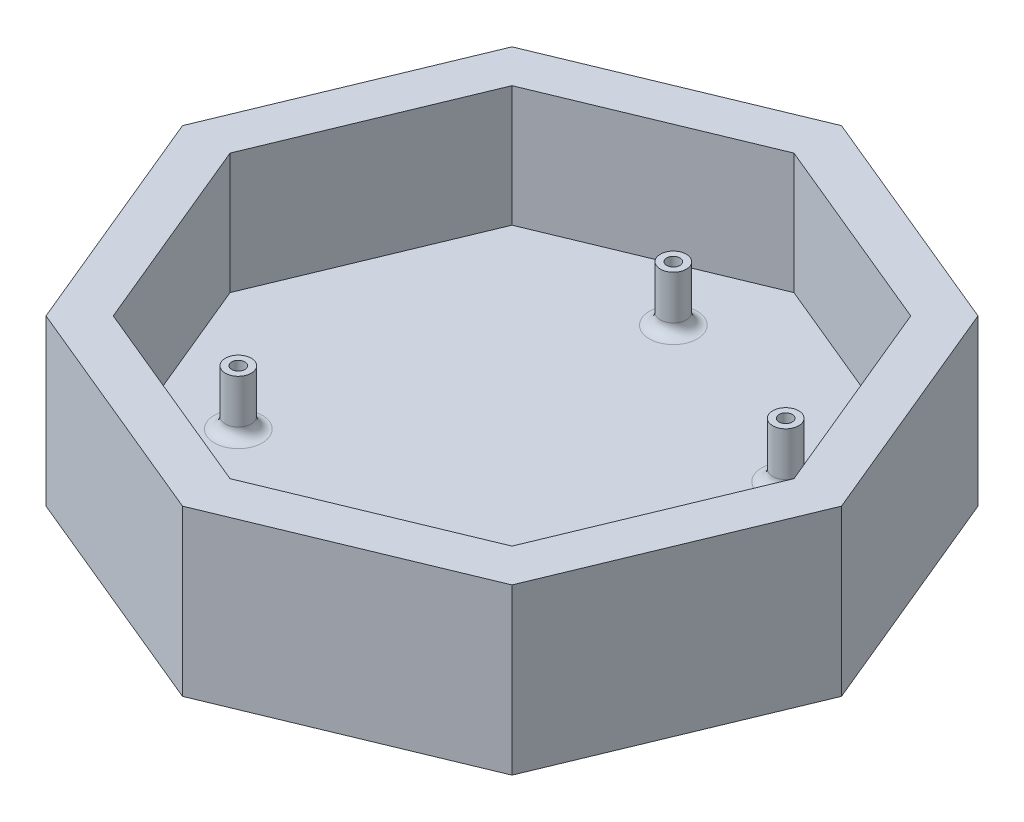
ISO-10303-21;
HEADER;
FILE_DESCRIPTION(('STEP AP214'),'2;1');
FILE_NAME('part.step','',(''),(''),'','','');
FILE_SCHEMA(('AUTOMOTIVE_DESIGN { 1 0 10303 214 1 1 1 1 }'));
ENDSEC;
DATA;
#1=APPLICATION_CONTEXT('core data for automotive mechanical design processes');
#2=APPLICATION_PROTOCOL_DEFINITION('international standard','automotive_design',2000,#1);
#3=PRODUCT_CONTEXT('',#1,'mechanical');
#4=PRODUCT('Part','Part','',(#3));
#5=PRODUCT_RELATED_PRODUCT_CATEGORY('part','',(#4));
#6=PRODUCT_DEFINITION_FORMATION('','',#4);
#7=PRODUCT_DEFINITION_CONTEXT('part definition',#1,'design');
#8=PRODUCT_DEFINITION('design','',#6,#7);
#9=PRODUCT_DEFINITION_SHAPE('','',#8);
#10=(LENGTH_UNIT() NAMED_UNIT(*) SI_UNIT(.MILLI.,.METRE.));
#11=(NAMED_UNIT(*) PLANE_ANGLE_UNIT() SI_UNIT($,.RADIAN.));
#12=(NAMED_UNIT(*) SI_UNIT($,.STERADIAN.) SOLID_ANGLE_UNIT());
#13=UNCERTAINTY_MEASURE_WITH_UNIT(LENGTH_MEASURE(1.E-05),#10,'distance_accuracy_value','');
#14=(GEOMETRIC_REPRESENTATION_CONTEXT(3) GLOBAL_UNCERTAINTY_ASSIGNED_CONTEXT((#13)) GLOBAL_UNIT_ASSIGNED_CONTEXT((#10,
#11,#12)) REPRESENTATION_CONTEXT('',''));
#15=CARTESIAN_POINT('',(0.,0.,0.));
#16=DIRECTION('',(0.,0.,1.));
#17=DIRECTION('',(1.,0.,0.));
#18=AXIS2_PLACEMENT_3D('',#15,#16,#17);
#19=CARTESIAN_POINT('',(-8.66519910435943E-13,38.1,-76.2));
#20=DIRECTION('',(0.3826834323651,0.,0.923879532511282));
#21=DIRECTION('',(0.923879532511282,0.,-0.3826834323651));
#22=AXIS2_PLACEMENT_3D('',#19,#20,#21);
#23=PLANE('',#22);
#24=DIRECTION('',(-0.923879532511282,0.,0.3826834323651));
#25=VECTOR('',#24,1.);
#26=CARTESIAN_POINT('',(-8.66519910435943E-13,0.,-76.2));
#27=LINE('',#26,#25);
#28=CARTESIAN_POINT('',(-8.66519910435943E-13,0.,-76.2));
#29=VERTEX_POINT('',#28);
#30=CARTESIAN_POINT('',(-53.8815367264155,0.,-53.8815367264143));
#31=VERTEX_POINT('',#30);
#32=EDGE_CURVE('E146',#29,#31,#27,.T.);
#33=ORIENTED_EDGE('',*,*,#32,.T.);
#34=DIRECTION('',(0.,-1.,0.));
#35=VECTOR('',#34,1.);
#36=CARTESIAN_POINT('',(-53.8815367264155,38.1,-53.8815367264143));
#37=LINE('',#36,#35);
#38=CARTESIAN_POINT('',(-53.8815367264155,38.1,-53.8815367264143));
#39=VERTEX_POINT('',#38);
#40=EDGE_CURVE('E175',#39,#31,#37,.T.);
#41=ORIENTED_EDGE('',*,*,#40,.F.);
#42=DIRECTION('',(-0.923879532511282,0.,0.3826834323651));
#43=VECTOR('',#42,1.);
#44=CARTESIAN_POINT('',(-8.66519910435943E-13,38.1,-76.2));
#45=LINE('',#44,#43);
#46=CARTESIAN_POINT('',(-8.66519910435943E-13,38.1,-76.2));
#47=VERTEX_POINT('',#46);
#48=EDGE_CURVE('E162',#47,#39,#45,.T.);
#49=ORIENTED_EDGE('',*,*,#48,.F.);
#50=DIRECTION('',(0.,-1.,0.));
#51=VECTOR('',#50,1.);
#52=CARTESIAN_POINT('',(-8.66519910435943E-13,38.1,-76.2));
#53=LINE('',#52,#51);
#54=EDGE_CURVE('E142',#47,#29,#53,.T.);
#55=ORIENTED_EDGE('',*,*,#54,.T.);
#56=EDGE_LOOP('',(#33,#41,#49,#55));
#57=FACE_BOUND('',#56,.T.);
#58=ADVANCED_FACE('F37',(#57),#23,.F.);
#59=CARTESIAN_POINT('',(-53.8815367264155,38.1,-53.8815367264143));
#60=DIRECTION('',(0.923879532511291,0.,0.382683432365079));
#61=DIRECTION('',(0.382683432365079,0.,-0.923879532511291));
#62=AXIS2_PLACEMENT_3D('',#59,#60,#61);
#63=PLANE('',#62);
#64=DIRECTION('',(-0.382683432365079,0.,0.923879532511291));
#65=VECTOR('',#64,1.);
#66=CARTESIAN_POINT('',(-53.8815367264155,0.,-53.8815367264143));
#67=LINE('',#66,#65);
#68=CARTESIAN_POINT('',(-76.2,0.,8.80545636405828E-13));
#69=VERTEX_POINT('',#68);
#70=EDGE_CURVE('E149',#31,#69,#67,.T.);
#71=ORIENTED_EDGE('',*,*,#70,.T.);
#72=DIRECTION('',(0.,-1.,0.));
#73=VECTOR('',#72,1.);
#74=CARTESIAN_POINT('',(-76.2,38.1,8.80545636405828E-13));
#75=LINE('',#74,#73);
#76=CARTESIAN_POINT('',(-76.2,38.1,8.80545636405828E-13));
#77=VERTEX_POINT('',#76);
#78=EDGE_CURVE('E172',#77,#69,#75,.T.);
#79=ORIENTED_EDGE('',*,*,#78,.F.);
#80=DIRECTION('',(-0.382683432365079,0.,0.923879532511291));
#81=VECTOR('',#80,1.);
#82=CARTESIAN_POINT('',(-53.8815367264155,38.1,-53.8815367264143));
#83=LINE('',#82,#81);
#84=EDGE_CURVE('E103',#39,#77,#83,.T.);
#85=ORIENTED_EDGE('',*,*,#84,.F.);
#86=ORIENTED_EDGE('',*,*,#40,.T.);
#87=EDGE_LOOP('',(#71,#79,#85,#86));
#88=FACE_BOUND('',#87,.T.);
#89=ADVANCED_FACE('F215',(#88),#63,.F.);
#90=CARTESIAN_POINT('',(-76.2,38.1,8.80545636405828E-13));
#91=DIRECTION('',(0.923879532511282,0.,-0.3826834323651));
#92=DIRECTION('',(-0.3826834323651,0.,-0.923879532511283));
#93=AXIS2_PLACEMENT_3D('',#90,#91,#92);
#94=PLANE('',#93);
#95=DIRECTION('',(0.3826834323651,0.,0.923879532511282));
#96=VECTOR('',#95,1.);
#97=CARTESIAN_POINT('',(-76.2,0.,8.80545636405828E-13));
#98=LINE('',#97,#96);
#99=CARTESIAN_POINT('',(-53.8815367264143,0.,53.8815367264155));
#100=VERTEX_POINT('',#99);
#101=EDGE_CURVE('E152',#69,#100,#98,.T.);
#102=ORIENTED_EDGE('',*,*,#101,.T.);
#103=DIRECTION('',(0.,-1.,0.));
#104=VECTOR('',#103,1.);
#105=CARTESIAN_POINT('',(-53.8815367264143,38.1,53.8815367264155));
#106=LINE('',#105,#104);
#107=CARTESIAN_POINT('',(-53.8815367264143,38.1,53.8815367264155));
#108=VERTEX_POINT('',#107);
#109=EDGE_CURVE('E169',#108,#100,#106,.T.);
#110=ORIENTED_EDGE('',*,*,#109,.F.);
#111=DIRECTION('',(0.3826834323651,0.,0.923879532511282));
#112=VECTOR('',#111,1.);
#113=CARTESIAN_POINT('',(-76.2,38.1,8.80545636405828E-13));
#114=LINE('',#113,#112);
#115=EDGE_CURVE('E330',#77,#108,#114,.T.);
#116=ORIENTED_EDGE('',*,*,#115,.F.);
#117=ORIENTED_EDGE('',*,*,#78,.T.);
#118=EDGE_LOOP('',(#102,#110,#116,#117));
#119=FACE_BOUND('',#118,.T.);
#120=ADVANCED_FACE('F221',(#119),#94,.F.);
#121=CARTESIAN_POINT('',(-53.8815367264143,38.1,53.8815367264155));
#122=DIRECTION('',(0.382683432365079,0.,-0.923879532511291));
#123=DIRECTION('',(-0.923879532511291,0.,-0.382683432365079));
#124=AXIS2_PLACEMENT_3D('',#121,#122,#123);
#125=PLANE('',#124);
#126=DIRECTION('',(0.923879532511291,0.,0.382683432365079));
#127=VECTOR('',#126,1.);
#128=CARTESIAN_POINT('',(-53.8815367264143,0.,53.8815367264155));
#129=LINE('',#128,#127);
#130=CARTESIAN_POINT('',(8.69093207777113E-13,0.,76.2));
#131=VERTEX_POINT('',#130);
#132=EDGE_CURVE('E154',#100,#131,#129,.T.);
#133=ORIENTED_EDGE('',*,*,#132,.T.);
#134=DIRECTION('',(0.,-1.,0.));
#135=VECTOR('',#134,1.);
#136=CARTESIAN_POINT('',(8.69093207777113E-13,38.1,76.2));
#137=LINE('',#136,#135);
#138=CARTESIAN_POINT('',(8.69093207777113E-13,38.1,76.2));
#139=VERTEX_POINT('',#138);
#140=EDGE_CURVE('E166',#139,#131,#137,.T.);
#141=ORIENTED_EDGE('',*,*,#140,.F.);
#142=DIRECTION('',(0.923879532511291,0.,0.382683432365079));
#143=VECTOR('',#142,1.);
#144=CARTESIAN_POINT('',(-53.8815367264143,38.1,53.8815367264155));
#145=LINE('',#144,#143);
#146=EDGE_CURVE('E332',#108,#139,#145,.T.);
#147=ORIENTED_EDGE('',*,*,#146,.F.);
#148=ORIENTED_EDGE('',*,*,#109,.T.);
#149=EDGE_LOOP('',(#133,#141,#147,#148));
#150=FACE_BOUND('',#149,.T.);
#151=ADVANCED_FACE('F338',(#150),#125,.F.);
#152=CARTESIAN_POINT('',(8.69093207777113E-13,38.1,76.2));
#153=DIRECTION('',(-0.3826834323651,0.,-0.923879532511282));
#154=DIRECTION('',(-0.923879532511282,0.,0.3826834323651));
#155=AXIS2_PLACEMENT_3D('',#152,#153,#154);
#156=PLANE('',#155);
#157=DIRECTION('',(0.923879532511282,0.,-0.3826834323651));
#158=VECTOR('',#157,1.);
#159=CARTESIAN_POINT('',(8.69093207777113E-13,0.,76.2));
#160=LINE('',#159,#158);
#161=CARTESIAN_POINT('',(53.8815367264155,0.,53.8815367264143));
#162=VERTEX_POINT('',#161);
#163=EDGE_CURVE('E156',#131,#162,#160,.T.);
#164=ORIENTED_EDGE('',*,*,#163,.T.);
#165=DIRECTION('',(0.,-1.,0.));
#166=VECTOR('',#165,1.);
#167=CARTESIAN_POINT('',(53.8815367264155,38.1,53.8815367264143));
#168=LINE('',#167,#166);
#169=CARTESIAN_POINT('',(53.8815367264155,38.1,53.8815367264143));
#170=VERTEX_POINT('',#169);
#171=EDGE_CURVE('E137',#170,#162,#168,.T.);
#172=ORIENTED_EDGE('',*,*,#171,.F.);
#173=DIRECTION('',(0.923879532511282,0.,-0.3826834323651));
#174=VECTOR('',#173,1.);
#175=CARTESIAN_POINT('',(8.69093207777113E-13,38.1,76.2));
#176=LINE('',#175,#174);
#177=EDGE_CURVE('E125',#139,#170,#176,.T.);
#178=ORIENTED_EDGE('',*,*,#177,.F.);
#179=ORIENTED_EDGE('',*,*,#140,.T.);
#180=EDGE_LOOP('',(#164,#172,#178,#179));
#181=FACE_BOUND('',#180,.T.);
#182=ADVANCED_FACE('F342',(#181),#156,.F.);
#183=CARTESIAN_POINT('',(53.8815367264155,38.1,53.8815367264143));
#184=DIRECTION('',(-0.923879532511291,0.,-0.38268343236508));
#185=DIRECTION('',(-0.38268343236508,0.,0.923879532511291));
#186=AXIS2_PLACEMENT_3D('',#183,#184,#185);
#187=PLANE('',#186);
#188=DIRECTION('',(0.38268343236508,0.,-0.923879532511291));
#189=VECTOR('',#188,1.);
#190=CARTESIAN_POINT('',(53.8815367264155,0.,53.8815367264143));
#191=LINE('',#190,#189);
#192=CARTESIAN_POINT('',(76.2,0.,-8.59728954694106E-13));
#193=VERTEX_POINT('',#192);
#194=EDGE_CURVE('E134',#162,#193,#191,.T.);
#195=ORIENTED_EDGE('',*,*,#194,.T.);
#196=DIRECTION('',(0.,-1.,0.));
#197=VECTOR('',#196,1.);
#198=CARTESIAN_POINT('',(76.2,38.1,-8.59728954694106E-13));
#199=LINE('',#198,#197);
#200=CARTESIAN_POINT('',(76.2,38.1,-8.59728954694106E-13));
#201=VERTEX_POINT('',#200);
#202=EDGE_CURVE('E131',#201,#193,#199,.T.);
#203=ORIENTED_EDGE('',*,*,#202,.F.);
#204=DIRECTION('',(0.38268343236508,0.,-0.923879532511291));
#205=VECTOR('',#204,1.);
#206=CARTESIAN_POINT('',(53.8815367264155,38.1,53.8815367264143));
#207=LINE('',#206,#205);
#208=EDGE_CURVE('E118',#170,#201,#207,.T.);
#209=ORIENTED_EDGE('',*,*,#208,.F.);
#210=ORIENTED_EDGE('',*,*,#171,.T.);
#211=EDGE_LOOP('',(#195,#203,#209,#210));
#212=FACE_BOUND('',#211,.T.);
#213=ADVANCED_FACE('F132',(#212),#187,.F.);
#214=CARTESIAN_POINT('',(76.2,38.1,-8.59728954694106E-13));
#215=DIRECTION('',(-0.923879532511282,0.,0.3826834323651));
#216=DIRECTION('',(0.3826834323651,0.,0.923879532511282));
#217=AXIS2_PLACEMENT_3D('',#214,#215,#216);
#218=PLANE('',#217);
#219=DIRECTION('',(-0.3826834323651,0.,-0.923879532511282));
#220=VECTOR('',#219,1.);
#221=CARTESIAN_POINT('',(76.2,0.,-8.59728954694106E-13));
#222=LINE('',#221,#220);
#223=CARTESIAN_POINT('',(53.8815367264143,0.,-53.8815367264155));
#224=VERTEX_POINT('',#223);
#225=EDGE_CURVE('E159',#193,#224,#222,.T.);
#226=ORIENTED_EDGE('',*,*,#225,.T.);
#227=DIRECTION('',(0.,-1.,0.));
#228=VECTOR('',#227,1.);
#229=CARTESIAN_POINT('',(53.8815367264143,38.1,-53.8815367264155));
#230=LINE('',#229,#228);
#231=CARTESIAN_POINT('',(53.8815367264143,38.1,-53.8815367264155));
#232=VERTEX_POINT('',#231);
#233=EDGE_CURVE('E138',#232,#224,#230,.T.);
#234=ORIENTED_EDGE('',*,*,#233,.F.);
#235=DIRECTION('',(-0.3826834323651,0.,-0.923879532511282));
#236=VECTOR('',#235,1.);
#237=CARTESIAN_POINT('',(76.2,38.1,-8.59728954694106E-13));
#238=LINE('',#237,#236);
#239=EDGE_CURVE('E122',#201,#232,#238,.T.);
#240=ORIENTED_EDGE('',*,*,#239,.F.);
#241=ORIENTED_EDGE('',*,*,#202,.T.);
#242=EDGE_LOOP('',(#226,#234,#240,#241));
#243=FACE_BOUND('',#242,.T.);
#244=ADVANCED_FACE('F140',(#243),#218,.F.);
#245=CARTESIAN_POINT('',(53.8815367264143,38.1,-53.8815367264155));
#246=DIRECTION('',(-0.382683432365079,0.,0.923879532511291));
#247=DIRECTION('',(0.923879532511291,0.,0.382683432365079));
#248=AXIS2_PLACEMENT_3D('',#245,#246,#247);
#249=PLANE('',#248);
#250=DIRECTION('',(-0.923879532511291,0.,-0.382683432365079));
#251=VECTOR('',#250,1.);
#252=CARTESIAN_POINT('',(53.8815367264143,0.,-53.8815367264155));
#253=LINE('',#252,#251);
#254=EDGE_CURVE('E94',#224,#29,#253,.T.);
#255=ORIENTED_EDGE('',*,*,#254,.T.);
#256=ORIENTED_EDGE('',*,*,#54,.F.);
#257=DIRECTION('',(-0.923879532511291,0.,-0.382683432365079));
#258=VECTOR('',#257,1.);
#259=CARTESIAN_POINT('',(53.8815367264143,38.1,-53.8815367264155));
#260=LINE('',#259,#258);
#261=EDGE_CURVE('E61',#232,#47,#260,.T.);
#262=ORIENTED_EDGE('',*,*,#261,.F.);
#263=ORIENTED_EDGE('',*,*,#233,.T.);
#264=EDGE_LOOP('',(#255,#256,#262,#263));
#265=FACE_BOUND('',#264,.T.);
#266=ADVANCED_FACE('F346',(#265),#249,.F.);
#267=CARTESIAN_POINT('',(0.,38.1,0.));
#268=DIRECTION('',(0.,1.,0.));
#269=DIRECTION('',(0.,0.,1.));
#270=AXIS2_PLACEMENT_3D('',#267,#268,#269);
#271=PLANE('',#270);
#272=DIRECTION('',(-0.923879532511282,0.,0.3826834323651));
#273=VECTOR('',#272,1.);
#274=CARTESIAN_POINT('',(3.88806367282855,38.1,-66.8133839496854));
#275=LINE('',#274,#273);
#276=CARTESIAN_POINT('',(-7.46309706567966E-13,38.1,-65.2028952450293));
#277=VERTEX_POINT('',#276);
#278=CARTESIAN_POINT('',(-46.1054093807568,38.1,-46.1054093807558));
#279=VERTEX_POINT('',#278);
#280=EDGE_CURVE('E307',#277,#279,#275,.T.);
#281=ORIENTED_EDGE('',*,*,#280,.F.);
#282=DIRECTION('',(-0.923879532511291,0.,-0.382683432365079));
#283=VECTOR('',#282,1.);
#284=CARTESIAN_POINT('',(49.9934730535851,38.1,-44.4949206761008));
#285=LINE('',#284,#283);
#286=CARTESIAN_POINT('',(46.1054093807558,38.1,-46.1054093807568));
#287=VERTEX_POINT('',#286);
#288=EDGE_CURVE('E271',#287,#277,#285,.T.);
#289=ORIENTED_EDGE('',*,*,#288,.F.);
#290=DIRECTION('',(-0.3826834323651,0.,-0.923879532511282));
#291=VECTOR('',#290,1.);
#292=CARTESIAN_POINT('',(66.8133839496854,38.1,3.88806367282856));
#293=LINE('',#292,#291);
#294=CARTESIAN_POINT('',(65.2028952450293,38.1,-7.41972020292823E-13));
#295=VERTEX_POINT('',#294);
#296=EDGE_CURVE('E325',#295,#287,#293,.T.);
#297=ORIENTED_EDGE('',*,*,#296,.F.);
#298=DIRECTION('',(0.38268343236508,0.,-0.923879532511291));
#299=VECTOR('',#298,1.);
#300=CARTESIAN_POINT('',(44.4949206761008,38.1,49.9934730535851));
#301=LINE('',#300,#299);
#302=CARTESIAN_POINT('',(46.1054093807568,38.1,46.1054093807558));
#303=VERTEX_POINT('',#302);
#304=EDGE_CURVE('E322',#303,#295,#301,.T.);
#305=ORIENTED_EDGE('',*,*,#304,.F.);
#306=DIRECTION('',(0.923879532511282,0.,-0.3826834323651));
#307=VECTOR('',#306,1.);
#308=CARTESIAN_POINT('',(-3.88806367282855,38.1,66.8133839496854));
#309=LINE('',#308,#307);
#310=CARTESIAN_POINT('',(7.41523195509056E-13,38.1,65.2028952450293));
#311=VERTEX_POINT('',#310);
#312=EDGE_CURVE('E319',#311,#303,#309,.T.);
#313=ORIENTED_EDGE('',*,*,#312,.F.);
#314=DIRECTION('',(0.923879532511291,0.,0.382683432365079));
#315=VECTOR('',#314,1.);
#316=CARTESIAN_POINT('',(-49.9934730535851,38.1,44.4949206761008));
#317=LINE('',#316,#315);
#318=CARTESIAN_POINT('',(-46.1054093807558,38.1,46.1054093807568));
#319=VERTEX_POINT('',#318);
#320=EDGE_CURVE('E316',#319,#311,#317,.T.);
#321=ORIENTED_EDGE('',*,*,#320,.F.);
#322=DIRECTION('',(0.3826834323651,0.,0.923879532511283));
#323=VECTOR('',#322,1.);
#324=CARTESIAN_POINT('',(-66.8133839496854,38.1,-3.88806367282854));
#325=LINE('',#324,#323);
#326=CARTESIAN_POINT('',(-65.2028952450293,38.1,7.60335432537851E-13));
#327=VERTEX_POINT('',#326);
#328=EDGE_CURVE('E313',#327,#319,#325,.T.);
#329=ORIENTED_EDGE('',*,*,#328,.F.);
#330=DIRECTION('',(-0.382683432365079,0.,0.923879532511291));
#331=VECTOR('',#330,1.);
#332=CARTESIAN_POINT('',(-44.4949206761008,38.1,-49.9934730535851));
#333=LINE('',#332,#331);
#334=EDGE_CURVE('E310',#279,#327,#333,.T.);
#335=ORIENTED_EDGE('',*,*,#334,.F.);
#336=EDGE_LOOP('',(#281,#289,#297,#305,#313,#321,#329,#335));
#337=FACE_BOUND('',#336,.T.);
#338=ORIENTED_EDGE('',*,*,#48,.T.);
#339=ORIENTED_EDGE('',*,*,#84,.T.);
#340=ORIENTED_EDGE('',*,*,#115,.T.);
#341=ORIENTED_EDGE('',*,*,#146,.T.);
#342=ORIENTED_EDGE('',*,*,#177,.T.);
#343=ORIENTED_EDGE('',*,*,#208,.T.);
#344=ORIENTED_EDGE('',*,*,#239,.T.);
#345=ORIENTED_EDGE('',*,*,#261,.T.);
#346=EDGE_LOOP('',(#338,#339,#340,#341,#342,#343,#344,#345));
#347=FACE_BOUND('',#346,.T.);
#348=ADVANCED_FACE('F120',(#337,#347),#271,.T.);
#349=CARTESIAN_POINT('',(0.,0.,0.));
#350=DIRECTION('',(0.,1.,0.));
#351=DIRECTION('',(0.,0.,1.));
#352=AXIS2_PLACEMENT_3D('',#349,#350,#351);
#353=PLANE('',#352);
#354=ORIENTED_EDGE('',*,*,#32,.F.);
#355=ORIENTED_EDGE('',*,*,#254,.F.);
#356=ORIENTED_EDGE('',*,*,#225,.F.);
#357=ORIENTED_EDGE('',*,*,#194,.F.);
#358=ORIENTED_EDGE('',*,*,#163,.F.);
#359=ORIENTED_EDGE('',*,*,#132,.F.);
#360=ORIENTED_EDGE('',*,*,#101,.F.);
#361=ORIENTED_EDGE('',*,*,#70,.F.);
#362=EDGE_LOOP('',(#354,#355,#356,#357,#358,#359,#360,#361));
#363=FACE_BOUND('',#362,.T.);
#364=ADVANCED_FACE('F345',(#363),#353,.F.);
#365=CARTESIAN_POINT('',(3.88806367282855,38.1,-66.8133839496854));
#366=DIRECTION('',(0.3826834323651,0.,0.923879532511282));
#367=DIRECTION('',(0.923879532511282,0.,-0.3826834323651));
#368=AXIS2_PLACEMENT_3D('',#365,#366,#367);
#369=PLANE('',#368);
#370=DIRECTION('',(-0.923879532511282,0.,0.3826834323651));
#371=VECTOR('',#370,1.);
#372=CARTESIAN_POINT('',(3.88806367282855,10.16,-66.8133839496854));
#373=LINE('',#372,#371);
#374=CARTESIAN_POINT('',(-7.46309706567966E-13,10.16,-65.2028952450293));
#375=VERTEX_POINT('',#374);
#376=CARTESIAN_POINT('',(-46.1054093807568,10.16,-46.1054093807558));
#377=VERTEX_POINT('',#376);
#378=EDGE_CURVE('E261',#375,#377,#373,.T.);
#379=ORIENTED_EDGE('',*,*,#378,.F.);
#380=DIRECTION('',(0.,-1.,0.));
#381=VECTOR('',#380,1.);
#382=CARTESIAN_POINT('',(-7.48533179883992E-13,38.1,-65.2028952450293));
#383=LINE('',#382,#381);
#384=EDGE_CURVE('E268',#277,#375,#383,.T.);
#385=ORIENTED_EDGE('',*,*,#384,.F.);
#386=ORIENTED_EDGE('',*,*,#280,.T.);
#387=DIRECTION('',(0.,-1.,0.));
#388=VECTOR('',#387,1.);
#389=CARTESIAN_POINT('',(-46.1054093807568,38.1,-46.1054093807558));
#390=LINE('',#389,#388);
#391=EDGE_CURVE('E150',#279,#377,#390,.T.);
#392=ORIENTED_EDGE('',*,*,#391,.T.);
#393=EDGE_LOOP('',(#379,#385,#386,#392));
#394=FACE_BOUND('',#393,.T.);
#395=ADVANCED_FACE('F367',(#394),#369,.T.);
#396=CARTESIAN_POINT('',(-44.4949206761008,38.1,-49.9934730535851));
#397=DIRECTION('',(0.923879532511291,0.,0.382683432365079));
#398=DIRECTION('',(0.382683432365079,0.,-0.923879532511291));
#399=AXIS2_PLACEMENT_3D('',#396,#397,#398);
#400=PLANE('',#399);
#401=DIRECTION('',(-0.382683432365079,0.,0.923879532511291));
#402=VECTOR('',#401,1.);
#403=CARTESIAN_POINT('',(-44.4949206761008,10.16,-49.9934730535851));
#404=LINE('',#403,#402);
#405=CARTESIAN_POINT('',(-65.2028952450293,10.16,7.60335432537851E-13));
#406=VERTEX_POINT('',#405);
#407=EDGE_CURVE('E264',#377,#406,#404,.T.);
#408=ORIENTED_EDGE('',*,*,#407,.F.);
#409=ORIENTED_EDGE('',*,*,#391,.F.);
#410=ORIENTED_EDGE('',*,*,#334,.T.);
#411=DIRECTION('',(0.,-1.,0.));
#412=VECTOR('',#411,1.);
#413=CARTESIAN_POINT('',(-65.2028952450293,38.1,7.61109925084824E-13));
#414=LINE('',#413,#412);
#415=EDGE_CURVE('E267',#327,#406,#414,.T.);
#416=ORIENTED_EDGE('',*,*,#415,.T.);
#417=EDGE_LOOP('',(#408,#409,#410,#416));
#418=FACE_BOUND('',#417,.T.);
#419=ADVANCED_FACE('F398',(#418),#400,.T.);
#420=CARTESIAN_POINT('',(-66.8133839496854,38.1,-3.88806367282854));
#421=DIRECTION('',(0.923879532511282,0.,-0.3826834323651));
#422=DIRECTION('',(-0.3826834323651,0.,-0.923879532511283));
#423=AXIS2_PLACEMENT_3D('',#420,#421,#422);
#424=PLANE('',#423);
#425=DIRECTION('',(0.3826834323651,0.,0.923879532511283));
#426=VECTOR('',#425,1.);
#427=CARTESIAN_POINT('',(-66.8133839496854,10.16,-3.88806367282854));
#428=LINE('',#427,#426);
#429=CARTESIAN_POINT('',(-46.1054093807558,10.16,46.1054093807568));
#430=VERTEX_POINT('',#429);
#431=EDGE_CURVE('E274',#406,#430,#428,.T.);
#432=ORIENTED_EDGE('',*,*,#431,.F.);
#433=ORIENTED_EDGE('',*,*,#415,.F.);
#434=ORIENTED_EDGE('',*,*,#328,.T.);
#435=DIRECTION('',(0.,-1.,0.));
#436=VECTOR('',#435,1.);
#437=CARTESIAN_POINT('',(-46.1054093807558,38.1,46.1054093807568));
#438=LINE('',#437,#436);
#439=EDGE_CURVE('E277',#319,#430,#438,.T.);
#440=ORIENTED_EDGE('',*,*,#439,.T.);
#441=EDGE_LOOP('',(#432,#433,#434,#440));
#442=FACE_BOUND('',#441,.T.);
#443=ADVANCED_FACE('F394',(#442),#424,.T.);
#444=CARTESIAN_POINT('',(-49.9934730535851,38.1,44.4949206761008));
#445=DIRECTION('',(0.382683432365079,0.,-0.923879532511291));
#446=DIRECTION('',(-0.923879532511291,0.,-0.382683432365079));
#447=AXIS2_PLACEMENT_3D('',#444,#445,#446);
#448=PLANE('',#447);
#449=DIRECTION('',(0.923879532511291,0.,0.382683432365079));
#450=VECTOR('',#449,1.);
#451=CARTESIAN_POINT('',(-49.9934730535851,10.16,44.4949206761008));
#452=LINE('',#451,#450);
#453=CARTESIAN_POINT('',(7.41523195509056E-13,10.16,65.2028952450293));
#454=VERTEX_POINT('',#453);
#455=EDGE_CURVE('E280',#430,#454,#452,.T.);
#456=ORIENTED_EDGE('',*,*,#455,.F.);
#457=ORIENTED_EDGE('',*,*,#439,.F.);
#458=ORIENTED_EDGE('',*,*,#320,.T.);
#459=DIRECTION('',(0.,-1.,0.));
#460=VECTOR('',#459,1.);
#461=CARTESIAN_POINT('',(7.48966860752986E-13,38.1,65.2028952450293));
#462=LINE('',#461,#460);
#463=EDGE_CURVE('E283',#311,#454,#462,.T.);
#464=ORIENTED_EDGE('',*,*,#463,.T.);
#465=EDGE_LOOP('',(#456,#457,#458,#464));
#466=FACE_BOUND('',#465,.T.);
#467=ADVANCED_FACE('F390',(#466),#448,.T.);
#468=CARTESIAN_POINT('',(-3.88806367282855,38.1,66.8133839496854));
#469=DIRECTION('',(-0.3826834323651,0.,-0.923879532511282));
#470=DIRECTION('',(-0.923879532511282,0.,0.3826834323651));
#471=AXIS2_PLACEMENT_3D('',#468,#469,#470);
#472=PLANE('',#471);
#473=DIRECTION('',(0.923879532511282,0.,-0.3826834323651));
#474=VECTOR('',#473,1.);
#475=CARTESIAN_POINT('',(-3.88806367282855,10.16,66.8133839496854));
#476=LINE('',#475,#474);
#477=CARTESIAN_POINT('',(46.1054093807568,10.16,46.1054093807558));
#478=VERTEX_POINT('',#477);
#479=EDGE_CURVE('E286',#454,#478,#476,.T.);
#480=ORIENTED_EDGE('',*,*,#479,.F.);
#481=ORIENTED_EDGE('',*,*,#463,.F.);
#482=ORIENTED_EDGE('',*,*,#312,.T.);
#483=DIRECTION('',(0.,-1.,0.));
#484=VECTOR('',#483,1.);
#485=CARTESIAN_POINT('',(46.1054093807568,38.1,46.1054093807558));
#486=LINE('',#485,#484);
#487=EDGE_CURVE('E289',#303,#478,#486,.T.);
#488=ORIENTED_EDGE('',*,*,#487,.T.);
#489=EDGE_LOOP('',(#480,#481,#482,#488));
#490=FACE_BOUND('',#489,.T.);
#491=ADVANCED_FACE('F386',(#490),#472,.T.);
#492=CARTESIAN_POINT('',(44.4949206761008,38.1,49.9934730535851));
#493=DIRECTION('',(-0.923879532511291,0.,-0.38268343236508));
#494=DIRECTION('',(-0.38268343236508,0.,0.923879532511291));
#495=AXIS2_PLACEMENT_3D('',#492,#493,#494);
#496=PLANE('',#495);
#497=DIRECTION('',(0.38268343236508,0.,-0.923879532511291));
#498=VECTOR('',#497,1.);
#499=CARTESIAN_POINT('',(44.4949206761008,10.16,49.9934730535851));
#500=LINE('',#499,#498);
#501=CARTESIAN_POINT('',(65.2028952450293,10.16,-7.41972020292823E-13));
#502=VERTEX_POINT('',#501);
#503=EDGE_CURVE('E292',#478,#502,#500,.T.);
#504=ORIENTED_EDGE('',*,*,#503,.F.);
#505=ORIENTED_EDGE('',*,*,#487,.F.);
#506=ORIENTED_EDGE('',*,*,#304,.T.);
#507=DIRECTION('',(0.,-1.,0.));
#508=VECTOR('',#507,1.);
#509=CARTESIAN_POINT('',(65.2028952450293,38.1,-7.42027966849079E-13));
#510=LINE('',#509,#508);
#511=EDGE_CURVE('E295',#295,#502,#510,.T.);
#512=ORIENTED_EDGE('',*,*,#511,.T.);
#513=EDGE_LOOP('',(#504,#505,#506,#512));
#514=FACE_BOUND('',#513,.T.);
#515=ADVANCED_FACE('F382',(#514),#496,.T.);
#516=CARTESIAN_POINT('',(66.8133839496854,38.1,3.88806367282856));
#517=DIRECTION('',(-0.923879532511282,0.,0.3826834323651));
#518=DIRECTION('',(0.3826834323651,0.,0.923879532511282));
#519=AXIS2_PLACEMENT_3D('',#516,#517,#518);
#520=PLANE('',#519);
#521=DIRECTION('',(-0.3826834323651,0.,-0.923879532511282));
#522=VECTOR('',#521,1.);
#523=CARTESIAN_POINT('',(66.8133839496854,10.16,3.88806367282856));
#524=LINE('',#523,#522);
#525=CARTESIAN_POINT('',(46.1054093807558,10.16,-46.1054093807568));
#526=VERTEX_POINT('',#525);
#527=EDGE_CURVE('E298',#502,#526,#524,.T.);
#528=ORIENTED_EDGE('',*,*,#527,.F.);
#529=ORIENTED_EDGE('',*,*,#511,.F.);
#530=ORIENTED_EDGE('',*,*,#296,.T.);
#531=DIRECTION('',(0.,-1.,0.));
#532=VECTOR('',#531,1.);
#533=CARTESIAN_POINT('',(46.1054093807558,38.1,-46.1054093807568));
#534=LINE('',#533,#532);
#535=EDGE_CURVE('E52',#287,#526,#534,.T.);
#536=ORIENTED_EDGE('',*,*,#535,.T.);
#537=EDGE_LOOP('',(#528,#529,#530,#536));
#538=FACE_BOUND('',#537,.T.);
#539=ADVANCED_FACE('F379',(#538),#520,.T.);
#540=CARTESIAN_POINT('',(49.9934730535851,38.1,-44.4949206761008));
#541=DIRECTION('',(-0.382683432365079,0.,0.923879532511291));
#542=DIRECTION('',(0.923879532511291,0.,0.382683432365079));
#543=AXIS2_PLACEMENT_3D('',#540,#541,#542);
#544=PLANE('',#543);
#545=DIRECTION('',(-0.923879532511291,0.,-0.382683432365079));
#546=VECTOR('',#545,1.);
#547=CARTESIAN_POINT('',(49.9934730535851,10.16,-44.4949206761008));
#548=LINE('',#547,#546);
#549=EDGE_CURVE('E303',#526,#375,#548,.T.);
#550=ORIENTED_EDGE('',*,*,#549,.F.);
#551=ORIENTED_EDGE('',*,*,#535,.F.);
#552=ORIENTED_EDGE('',*,*,#288,.T.);
#553=ORIENTED_EDGE('',*,*,#384,.T.);
#554=EDGE_LOOP('',(#550,#551,#552,#553));
#555=FACE_BOUND('',#554,.T.);
#556=ADVANCED_FACE('F375',(#555),#544,.T.);
#557=CARTESIAN_POINT('',(0.,10.16,0.));
#558=DIRECTION('',(0.,1.,0.));
#559=DIRECTION('',(0.,0.,1.));
#560=AXIS2_PLACEMENT_3D('',#557,#558,#559);
#561=PLANE('',#560);
#562=CARTESIAN_POINT('',(7.43979663421544,10.16,44.7537643784466));
#563=DIRECTION('',(0.,1.,0.));
#564=DIRECTION('',(0.,0.,1.));
#565=AXIS2_PLACEMENT_3D('',#562,#563,#564);
#566=CIRCLE('',#565,5.54065381724516);
#567=CARTESIAN_POINT('',(7.43979663421544,10.16,50.2944181956918));
#568=VERTEX_POINT('',#567);
#569=EDGE_CURVE('E189',#568,#568,#566,.F.);
#570=ORIENTED_EDGE('',*,*,#569,.T.);
#571=EDGE_LOOP('',(#570));
#572=FACE_BOUND('',#571,.T.);
#573=CARTESIAN_POINT('',(-36.9064209263266,10.16,26.3849596249228));
#574=DIRECTION('',(0.,1.,0.));
#575=DIRECTION('',(0.,0.,1.));
#576=AXIS2_PLACEMENT_3D('',#573,#574,#575);
#577=CIRCLE('',#576,5.5406538172452);
#578=CARTESIAN_POINT('',(-36.9064209263266,10.16,31.925613442168));
#579=VERTEX_POINT('',#578);
#580=EDGE_CURVE('E186',#579,#579,#577,.F.);
#581=ORIENTED_EDGE('',*,*,#580,.T.);
#582=EDGE_LOOP('',(#581));
#583=FACE_BOUND('',#582,.T.);
#584=CARTESIAN_POINT('',(36.9064209263265,10.16,-26.3849596249228));
#585=DIRECTION('',(0.,1.,0.));
#586=DIRECTION('',(0.,0.,1.));
#587=AXIS2_PLACEMENT_3D('',#584,#585,#586);
#588=CIRCLE('',#587,5.54065381724521);
#589=CARTESIAN_POINT('',(36.9064209263265,10.16,-20.8443058076776));
#590=VERTEX_POINT('',#589);
#591=EDGE_CURVE('E183',#590,#590,#588,.F.);
#592=ORIENTED_EDGE('',*,*,#591,.T.);
#593=EDGE_LOOP('',(#592));
#594=FACE_BOUND('',#593,.T.);
#595=CARTESIAN_POINT('',(-7.43979663421545,10.16,-44.7537643784466));
#596=DIRECTION('',(0.,1.,0.));
#597=DIRECTION('',(0.,0.,1.));
#598=AXIS2_PLACEMENT_3D('',#595,#596,#597);
#599=CIRCLE('',#598,5.54065381724522);
#600=CARTESIAN_POINT('',(-7.43979663421545,10.16,-39.2131105612014));
#601=VERTEX_POINT('',#600);
#602=EDGE_CURVE('E180',#601,#601,#599,.F.);
#603=ORIENTED_EDGE('',*,*,#602,.T.);
#604=EDGE_LOOP('',(#603));
#605=FACE_BOUND('',#604,.T.);
#606=ORIENTED_EDGE('',*,*,#378,.T.);
#607=ORIENTED_EDGE('',*,*,#407,.T.);
#608=ORIENTED_EDGE('',*,*,#431,.T.);
#609=ORIENTED_EDGE('',*,*,#455,.T.);
#610=ORIENTED_EDGE('',*,*,#479,.T.);
#611=ORIENTED_EDGE('',*,*,#503,.T.);
#612=ORIENTED_EDGE('',*,*,#527,.T.);
#613=ORIENTED_EDGE('',*,*,#549,.T.);
#614=EDGE_LOOP('',(#606,#607,#608,#609,#610,#611,#612,#613));
#615=FACE_BOUND('',#614,.T.);
#616=ADVANCED_FACE('F371',(#572,#583,#594,#605,#615),#561,.T.);
#617=CARTESIAN_POINT('',(-7.43979663421545,22.86,-44.7537643784466));
#618=DIRECTION('',(0.,-1.,0.));
#619=DIRECTION('',(0.,0.,-1.));
#620=AXIS2_PLACEMENT_3D('',#617,#618,#619);
#621=CYLINDRICAL_SURFACE('',#620,3.00065381724522);
#622=CARTESIAN_POINT('',(-7.43979663421545,12.7,-44.7537643784466));
#623=DIRECTION('',(0.,1.,0.));
#624=DIRECTION('',(0.,0.,1.));
#625=AXIS2_PLACEMENT_3D('',#622,#623,#624);
#626=CIRCLE('',#625,3.00065381724522);
#627=CARTESIAN_POINT('',(-7.43979663421545,12.7,-41.7531105612014));
#628=VERTEX_POINT('',#627);
#629=EDGE_CURVE('E11',#628,#628,#626,.T.);
#630=ORIENTED_EDGE('',*,*,#629,.T.);
#631=EDGE_LOOP('',(#630));
#632=FACE_BOUND('',#631,.T.);
#633=CARTESIAN_POINT('',(-7.43979663421545,22.86,-44.7537643784466));
#634=DIRECTION('',(0.,1.,0.));
#635=DIRECTION('',(0.,0.,1.));
#636=AXIS2_PLACEMENT_3D('',#633,#634,#635);
#637=CIRCLE('',#636,3.00065381724522);
#638=CARTESIAN_POINT('',(-7.43979663421545,22.86,-41.7531105612014));
#639=VERTEX_POINT('',#638);
#640=EDGE_CURVE('E252',#639,#639,#637,.T.);
#641=ORIENTED_EDGE('',*,*,#640,.F.);
#642=EDGE_LOOP('',(#641));
#643=FACE_BOUND('',#642,.T.);
#644=ADVANCED_FACE('F374',(#632,#643),#621,.T.);
#645=CARTESIAN_POINT('',(-7.43979663421545,22.86,-44.7537643784466));
#646=DIRECTION('',(0.,1.,0.));
#647=DIRECTION('',(0.,0.,1.));
#648=AXIS2_PLACEMENT_3D('',#645,#646,#647);
#649=PLANE('',#648);
#650=CARTESIAN_POINT('',(-7.43979663421545,22.86,-44.7537643784466));
#651=DIRECTION('',(0.,1.,0.));
#652=DIRECTION('',(0.,0.,1.));
#653=AXIS2_PLACEMENT_3D('',#650,#651,#652);
#654=CIRCLE('',#653,1.52399999999999);
#655=CARTESIAN_POINT('',(-7.43979663421545,22.86,-43.2297643784466));
#656=VERTEX_POINT('',#655);
#657=EDGE_CURVE('E462',#656,#656,#654,.T.);
#658=ORIENTED_EDGE('',*,*,#657,.F.);
#659=EDGE_LOOP('',(#658));
#660=FACE_BOUND('',#659,.T.);
#661=ORIENTED_EDGE('',*,*,#640,.T.);
#662=EDGE_LOOP('',(#661));
#663=FACE_BOUND('',#662,.T.);
#664=ADVANCED_FACE('F408',(#660,#663),#649,.T.);
#665=CARTESIAN_POINT('',(36.9064209263265,22.86,-26.3849596249228));
#666=DIRECTION('',(0.,-1.,0.));
#667=DIRECTION('',(0.,0.,-1.));
#668=AXIS2_PLACEMENT_3D('',#665,#666,#667);
#669=CYLINDRICAL_SURFACE('',#668,3.00065381724521);
#670=CARTESIAN_POINT('',(36.9064209263265,12.7,-26.3849596249228));
#671=DIRECTION('',(0.,1.,0.));
#672=DIRECTION('',(0.,0.,1.));
#673=AXIS2_PLACEMENT_3D('',#670,#671,#672);
#674=CIRCLE('',#673,3.00065381724521);
#675=CARTESIAN_POINT('',(36.9064209263265,12.7,-23.3843058076776));
#676=VERTEX_POINT('',#675);
#677=EDGE_CURVE('E45',#676,#676,#674,.T.);
#678=ORIENTED_EDGE('',*,*,#677,.T.);
#679=EDGE_LOOP('',(#678));
#680=FACE_BOUND('',#679,.T.);
#681=CARTESIAN_POINT('',(36.9064209263265,22.86,-26.3849596249228));
#682=DIRECTION('',(0.,1.,0.));
#683=DIRECTION('',(0.,0.,-1.));
#684=AXIS2_PLACEMENT_3D('',#681,#682,#683);
#685=CIRCLE('',#684,3.00065381724521);
#686=CARTESIAN_POINT('',(36.9064209263265,22.86,-29.385613442168));
#687=VERTEX_POINT('',#686);
#688=EDGE_CURVE('E248',#687,#687,#685,.T.);
#689=ORIENTED_EDGE('',*,*,#688,.F.);
#690=EDGE_LOOP('',(#689));
#691=FACE_BOUND('',#690,.T.);
#692=ADVANCED_FACE('F197',(#680,#691),#669,.T.);
#693=CARTESIAN_POINT('',(36.9064209263265,22.86,-26.3849596249228));
#694=DIRECTION('',(0.,-1.,0.));
#695=DIRECTION('',(0.,0.,-1.));
#696=AXIS2_PLACEMENT_3D('',#693,#694,#695);
#697=PLANE('',#696);
#698=CARTESIAN_POINT('',(36.9064209263265,22.86,-26.3849596249228));
#699=DIRECTION('',(0.,1.,0.));
#700=DIRECTION('',(0.,0.,1.));
#701=AXIS2_PLACEMENT_3D('',#698,#699,#700);
#702=CIRCLE('',#701,1.52399999999999);
#703=CARTESIAN_POINT('',(36.9064209263265,22.86,-24.8609596249228));
#704=VERTEX_POINT('',#703);
#705=EDGE_CURVE('E464',#704,#704,#702,.T.);
#706=ORIENTED_EDGE('',*,*,#705,.F.);
#707=EDGE_LOOP('',(#706));
#708=FACE_BOUND('',#707,.T.);
#709=ORIENTED_EDGE('',*,*,#688,.T.);
#710=EDGE_LOOP('',(#709));
#711=FACE_BOUND('',#710,.T.);
#712=ADVANCED_FACE('F242',(#708,#711),#697,.F.);
#713=CARTESIAN_POINT('',(7.43979663421544,22.86,44.7537643784466));
#714=DIRECTION('',(0.,-1.,0.));
#715=DIRECTION('',(0.,0.,-1.));
#716=AXIS2_PLACEMENT_3D('',#713,#714,#715);
#717=CYLINDRICAL_SURFACE('',#716,3.00065381724516);
#718=CARTESIAN_POINT('',(7.43979663421544,12.7,44.7537643784466));
#719=DIRECTION('',(0.,1.,0.));
#720=DIRECTION('',(0.,0.,1.));
#721=AXIS2_PLACEMENT_3D('',#718,#719,#720);
#722=CIRCLE('',#721,3.00065381724516);
#723=CARTESIAN_POINT('',(7.43979663421544,12.7,47.7544181956918));
#724=VERTEX_POINT('',#723);
#725=EDGE_CURVE('E177',#724,#724,#722,.T.);
#726=ORIENTED_EDGE('',*,*,#725,.T.);
#727=EDGE_LOOP('',(#726));
#728=FACE_BOUND('',#727,.T.);
#729=CARTESIAN_POINT('',(7.43979663421544,22.86,44.7537643784466));
#730=DIRECTION('',(0.,1.,0.));
#731=DIRECTION('',(0.,0.,1.));
#732=AXIS2_PLACEMENT_3D('',#729,#730,#731);
#733=CIRCLE('',#732,3.00065381724516);
#734=CARTESIAN_POINT('',(7.43979663421544,22.86,47.7544181956918));
#735=VERTEX_POINT('',#734);
#736=EDGE_CURVE('E246',#735,#735,#733,.T.);
#737=ORIENTED_EDGE('',*,*,#736,.F.);
#738=EDGE_LOOP('',(#737));
#739=FACE_BOUND('',#738,.T.);
#740=ADVANCED_FACE('F238',(#728,#739),#717,.T.);
#741=CARTESIAN_POINT('',(7.43979663421544,22.86,44.7537643784466));
#742=DIRECTION('',(0.,1.,0.));
#743=DIRECTION('',(0.,0.,1.));
#744=AXIS2_PLACEMENT_3D('',#741,#742,#743);
#745=PLANE('',#744);
#746=CARTESIAN_POINT('',(7.43979663421544,22.86,44.7537643784466));
#747=DIRECTION('',(0.,1.,0.));
#748=DIRECTION('',(0.,0.,1.));
#749=AXIS2_PLACEMENT_3D('',#746,#747,#748);
#750=CIRCLE('',#749,1.52399999999999);
#751=CARTESIAN_POINT('',(7.43979663421544,22.86,46.2777643784466));
#752=VERTEX_POINT('',#751);
#753=EDGE_CURVE('E472',#752,#752,#750,.T.);
#754=ORIENTED_EDGE('',*,*,#753,.F.);
#755=EDGE_LOOP('',(#754));
#756=FACE_BOUND('',#755,.T.);
#757=ORIENTED_EDGE('',*,*,#736,.T.);
#758=EDGE_LOOP('',(#757));
#759=FACE_BOUND('',#758,.T.);
#760=ADVANCED_FACE('F241',(#756,#759),#745,.T.);
#761=CARTESIAN_POINT('',(-36.9064209263266,22.86,26.3849596249228));
#762=DIRECTION('',(0.,-1.,0.));
#763=DIRECTION('',(0.,0.,-1.));
#764=AXIS2_PLACEMENT_3D('',#761,#762,#763);
#765=CYLINDRICAL_SURFACE('',#764,3.0006538172452);
#766=CARTESIAN_POINT('',(-36.9064209263266,12.7,26.3849596249228));
#767=DIRECTION('',(0.,1.,0.));
#768=DIRECTION('',(0.,0.,1.));
#769=AXIS2_PLACEMENT_3D('',#766,#767,#768);
#770=CIRCLE('',#769,3.0006538172452);
#771=CARTESIAN_POINT('',(-36.9064209263266,12.7,29.385613442168));
#772=VERTEX_POINT('',#771);
#773=EDGE_CURVE('E192',#772,#772,#770,.T.);
#774=ORIENTED_EDGE('',*,*,#773,.T.);
#775=EDGE_LOOP('',(#774));
#776=FACE_BOUND('',#775,.T.);
#777=CARTESIAN_POINT('',(-36.9064209263266,22.86,26.3849596249228));
#778=DIRECTION('',(0.,1.,0.));
#779=DIRECTION('',(0.,0.,-1.));
#780=AXIS2_PLACEMENT_3D('',#777,#778,#779);
#781=CIRCLE('',#780,3.0006538172452);
#782=CARTESIAN_POINT('',(-36.9064209263266,22.86,23.3843058076776));
#783=VERTEX_POINT('',#782);
#784=EDGE_CURVE('E249',#783,#783,#781,.T.);
#785=ORIENTED_EDGE('',*,*,#784,.F.);
#786=EDGE_LOOP('',(#785));
#787=FACE_BOUND('',#786,.T.);
#788=ADVANCED_FACE('F231',(#776,#787),#765,.T.);
#789=CARTESIAN_POINT('',(-36.9064209263266,22.86,26.3849596249228));
#790=DIRECTION('',(0.,-1.,0.));
#791=DIRECTION('',(0.,0.,-1.));
#792=AXIS2_PLACEMENT_3D('',#789,#790,#791);
#793=PLANE('',#792);
#794=CARTESIAN_POINT('',(-36.9064209263266,22.86,26.3849596249228));
#795=DIRECTION('',(0.,1.,0.));
#796=DIRECTION('',(0.,0.,1.));
#797=AXIS2_PLACEMENT_3D('',#794,#795,#796);
#798=CIRCLE('',#797,1.52399999999999);
#799=CARTESIAN_POINT('',(-36.9064209263266,22.86,27.9089596249228));
#800=VERTEX_POINT('',#799);
#801=EDGE_CURVE('E478',#800,#800,#798,.T.);
#802=ORIENTED_EDGE('',*,*,#801,.F.);
#803=EDGE_LOOP('',(#802));
#804=FACE_BOUND('',#803,.T.);
#805=ORIENTED_EDGE('',*,*,#784,.T.);
#806=EDGE_LOOP('',(#805));
#807=FACE_BOUND('',#806,.T.);
#808=ADVANCED_FACE('F226',(#804,#807),#793,.F.);
#809=CARTESIAN_POINT('',(7.43979663421544,12.7,44.7537643784466));
#810=DIRECTION('',(0.,1.,0.));
#811=DIRECTION('',(0.,0.,1.));
#812=AXIS2_PLACEMENT_3D('',#809,#810,#811);
#813=TOROIDAL_SURFACE('',#812,5.54065381724516,2.54);
#814=ORIENTED_EDGE('',*,*,#569,.F.);
#815=EDGE_LOOP('',(#814));
#816=FACE_BOUND('',#815,.T.);
#817=ORIENTED_EDGE('',*,*,#725,.F.);
#818=EDGE_LOOP('',(#817));
#819=FACE_BOUND('',#818,.T.);
#820=ADVANCED_FACE('F210',(#816,#819),#813,.F.);
#821=CARTESIAN_POINT('',(-36.9064209263266,12.7,26.3849596249228));
#822=DIRECTION('',(0.,1.,0.));
#823=DIRECTION('',(0.,0.,1.));
#824=AXIS2_PLACEMENT_3D('',#821,#822,#823);
#825=TOROIDAL_SURFACE('',#824,5.5406538172452,2.54);
#826=ORIENTED_EDGE('',*,*,#580,.F.);
#827=EDGE_LOOP('',(#826));
#828=FACE_BOUND('',#827,.T.);
#829=ORIENTED_EDGE('',*,*,#773,.F.);
#830=EDGE_LOOP('',(#829));
#831=FACE_BOUND('',#830,.T.);
#832=ADVANCED_FACE('F202',(#828,#831),#825,.F.);
#833=CARTESIAN_POINT('',(36.9064209263265,12.7,-26.3849596249228));
#834=DIRECTION('',(0.,1.,0.));
#835=DIRECTION('',(0.,0.,1.));
#836=AXIS2_PLACEMENT_3D('',#833,#834,#835);
#837=TOROIDAL_SURFACE('',#836,5.54065381724521,2.54);
#838=ORIENTED_EDGE('',*,*,#591,.F.);
#839=EDGE_LOOP('',(#838));
#840=FACE_BOUND('',#839,.T.);
#841=ORIENTED_EDGE('',*,*,#677,.F.);
#842=EDGE_LOOP('',(#841));
#843=FACE_BOUND('',#842,.T.);
#844=ADVANCED_FACE('F200',(#840,#843),#837,.F.);
#845=CARTESIAN_POINT('',(-7.43979663421545,12.7,-44.7537643784466));
#846=DIRECTION('',(0.,1.,0.));
#847=DIRECTION('',(0.,0.,1.));
#848=AXIS2_PLACEMENT_3D('',#845,#846,#847);
#849=TOROIDAL_SURFACE('',#848,5.54065381724522,2.54);
#850=ORIENTED_EDGE('',*,*,#602,.F.);
#851=EDGE_LOOP('',(#850));
#852=FACE_BOUND('',#851,.T.);
#853=ORIENTED_EDGE('',*,*,#629,.F.);
#854=EDGE_LOOP('',(#853));
#855=FACE_BOUND('',#854,.T.);
#856=ADVANCED_FACE('F39',(#852,#855),#849,.F.);
#857=CARTESIAN_POINT('',(-36.9064209263266,13.97,26.3849596249228));
#858=DIRECTION('',(0.,1.,0.));
#859=DIRECTION('',(0.,0.,1.));
#860=AXIS2_PLACEMENT_3D('',#857,#858,#859);
#861=CONICAL_SURFACE('',#860,1.52399999999998,1.02974425867665);
#862=CARTESIAN_POINT('',(-36.9064209263266,13.054288416602,26.3849596249228));
#863=VERTEX_POINT('',#862);
#864=VERTEX_LOOP('',#863);
#865=FACE_BOUND('',#864,.T.);
#866=CARTESIAN_POINT('',(-36.9064209263266,13.97,26.3849596249228));
#867=DIRECTION('',(0.,1.,0.));
#868=DIRECTION('',(0.,0.,1.));
#869=AXIS2_PLACEMENT_3D('',#866,#867,#868);
#870=CIRCLE('',#869,1.52399999999998);
#871=CARTESIAN_POINT('',(-36.9064209263266,13.97,27.9089596249228));
#872=VERTEX_POINT('',#871);
#873=EDGE_CURVE('E255',#872,#872,#870,.T.);
#874=ORIENTED_EDGE('',*,*,#873,.T.);
#875=EDGE_LOOP('',(#874));
#876=FACE_BOUND('',#875,.T.);
#877=ADVANCED_FACE('F208',(#865,#876),#861,.F.);
#878=CARTESIAN_POINT('',(-36.9064209263266,22.86,26.3849596249228));
#879=DIRECTION('',(0.,1.,0.));
#880=DIRECTION('',(0.,0.,1.));
#881=AXIS2_PLACEMENT_3D('',#878,#879,#880);
#882=CYLINDRICAL_SURFACE('',#881,1.52399999999999);
#883=ORIENTED_EDGE('',*,*,#873,.F.);
#884=EDGE_LOOP('',(#883));
#885=FACE_BOUND('',#884,.T.);
#886=ORIENTED_EDGE('',*,*,#801,.T.);
#887=EDGE_LOOP('',(#886));
#888=FACE_BOUND('',#887,.T.);
#889=ADVANCED_FACE('F426',(#885,#888),#882,.F.);
#890=CARTESIAN_POINT('',(7.43979663421544,13.97,44.7537643784466));
#891=DIRECTION('',(0.,1.,0.));
#892=DIRECTION('',(0.,0.,1.));
#893=AXIS2_PLACEMENT_3D('',#890,#891,#892);
#894=CONICAL_SURFACE('',#893,1.52399999999999,1.02974425867665);
#895=CARTESIAN_POINT('',(7.43979663421544,13.054288416602,44.7537643784466));
#896=VERTEX_POINT('',#895);
#897=VERTEX_LOOP('',#896);
#898=FACE_BOUND('',#897,.T.);
#899=CARTESIAN_POINT('',(7.43979663421544,13.97,44.7537643784466));
#900=DIRECTION('',(0.,1.,0.));
#901=DIRECTION('',(0.,0.,1.));
#902=AXIS2_PLACEMENT_3D('',#899,#900,#901);
#903=CIRCLE('',#902,1.52399999999999);
#904=CARTESIAN_POINT('',(7.43979663421544,13.97,46.2777643784466));
#905=VERTEX_POINT('',#904);
#906=EDGE_CURVE('E475',#905,#905,#903,.T.);
#907=ORIENTED_EDGE('',*,*,#906,.T.);
#908=EDGE_LOOP('',(#907));
#909=FACE_BOUND('',#908,.T.);
#910=ADVANCED_FACE('F430',(#898,#909),#894,.F.);
#911=CARTESIAN_POINT('',(7.43979663421544,22.86,44.7537643784466));
#912=DIRECTION('',(0.,1.,0.));
#913=DIRECTION('',(0.,0.,1.));
#914=AXIS2_PLACEMENT_3D('',#911,#912,#913);
#915=CYLINDRICAL_SURFACE('',#914,1.52399999999999);
#916=ORIENTED_EDGE('',*,*,#906,.F.);
#917=EDGE_LOOP('',(#916));
#918=FACE_BOUND('',#917,.T.);
#919=ORIENTED_EDGE('',*,*,#753,.T.);
#920=EDGE_LOOP('',(#919));
#921=FACE_BOUND('',#920,.T.);
#922=ADVANCED_FACE('F434',(#918,#921),#915,.F.);
#923=CARTESIAN_POINT('',(36.9064209263265,13.97,-26.3849596249228));
#924=DIRECTION('',(0.,1.,0.));
#925=DIRECTION('',(0.,0.,1.));
#926=AXIS2_PLACEMENT_3D('',#923,#924,#925);
#927=CONICAL_SURFACE('',#926,1.52399999999998,1.02974425867665);
#928=CARTESIAN_POINT('',(36.9064209263265,13.054288416602,-26.3849596249228));
#929=VERTEX_POINT('',#928);
#930=VERTEX_LOOP('',#929);
#931=FACE_BOUND('',#930,.T.);
#932=CARTESIAN_POINT('',(36.9064209263265,13.97,-26.3849596249228));
#933=DIRECTION('',(0.,1.,0.));
#934=DIRECTION('',(0.,0.,1.));
#935=AXIS2_PLACEMENT_3D('',#932,#933,#934);
#936=CIRCLE('',#935,1.52399999999998);
#937=CARTESIAN_POINT('',(36.9064209263265,13.97,-24.8609596249228));
#938=VERTEX_POINT('',#937);
#939=EDGE_CURVE('E469',#938,#938,#936,.T.);
#940=ORIENTED_EDGE('',*,*,#939,.T.);
#941=EDGE_LOOP('',(#940));
#942=FACE_BOUND('',#941,.T.);
#943=ADVANCED_FACE('F438',(#931,#942),#927,.F.);
#944=CARTESIAN_POINT('',(36.9064209263265,22.86,-26.3849596249228));
#945=DIRECTION('',(0.,1.,0.));
#946=DIRECTION('',(0.,0.,1.));
#947=AXIS2_PLACEMENT_3D('',#944,#945,#946);
#948=CYLINDRICAL_SURFACE('',#947,1.52399999999999);
#949=ORIENTED_EDGE('',*,*,#939,.F.);
#950=EDGE_LOOP('',(#949));
#951=FACE_BOUND('',#950,.T.);
#952=ORIENTED_EDGE('',*,*,#705,.T.);
#953=EDGE_LOOP('',(#952));
#954=FACE_BOUND('',#953,.T.);
#955=ADVANCED_FACE('F442',(#951,#954),#948,.F.);
#956=CARTESIAN_POINT('',(-7.43979663421545,13.97,-44.7537643784466));
#957=DIRECTION('',(0.,1.,0.));
#958=DIRECTION('',(0.,0.,1.));
#959=AXIS2_PLACEMENT_3D('',#956,#957,#958);
#960=CONICAL_SURFACE('',#959,1.52399999999999,1.02974425867665);
#961=CARTESIAN_POINT('',(-7.43979663421545,13.054288416602,-44.7537643784466));
#962=VERTEX_POINT('',#961);
#963=VERTEX_LOOP('',#962);
#964=FACE_BOUND('',#963,.T.);
#965=CARTESIAN_POINT('',(-7.43979663421545,13.97,-44.7537643784466));
#966=DIRECTION('',(0.,1.,0.));
#967=DIRECTION('',(0.,0.,1.));
#968=AXIS2_PLACEMENT_3D('',#965,#966,#967);
#969=CIRCLE('',#968,1.52399999999999);
#970=CARTESIAN_POINT('',(-7.43979663421545,13.97,-43.2297643784466));
#971=VERTEX_POINT('',#970);
#972=EDGE_CURVE('E459',#971,#971,#969,.T.);
#973=ORIENTED_EDGE('',*,*,#972,.T.);
#974=EDGE_LOOP('',(#973));
#975=FACE_BOUND('',#974,.T.);
#976=ADVANCED_FACE('F446',(#964,#975),#960,.F.);
#977=CARTESIAN_POINT('',(-7.43979663421545,22.86,-44.7537643784466));
#978=DIRECTION('',(0.,1.,0.));
#979=DIRECTION('',(0.,0.,1.));
#980=AXIS2_PLACEMENT_3D('',#977,#978,#979);
#981=CYLINDRICAL_SURFACE('',#980,1.52399999999999);
#982=ORIENTED_EDGE('',*,*,#972,.F.);
#983=EDGE_LOOP('',(#982));
#984=FACE_BOUND('',#983,.T.);
#985=ORIENTED_EDGE('',*,*,#657,.T.);
#986=EDGE_LOOP('',(#985));
#987=FACE_BOUND('',#986,.T.);
#988=ADVANCED_FACE('F450',(#984,#987),#981,.F.);
#989=CLOSED_SHELL('',(#58,#89,#120,#151,#182,#213,#244,#266,#348,#364,#395,#419,#443,#467,#491,
#515,#539,#556,#616,#644,#664,#692,#712,#740,#760,#788,#808,#820,#832,#844,#856,#877,#889,#910,
#922,#943,#955,#976,#988));
#990=MANIFOLD_SOLID_BREP('B2',#989);
#991=ADVANCED_BREP_SHAPE_REPRESENTATION('',(#18,#990),#14);
#992=SHAPE_DEFINITION_REPRESENTATION(#9,#991);
ENDSEC;
END-ISO-10303-21;
